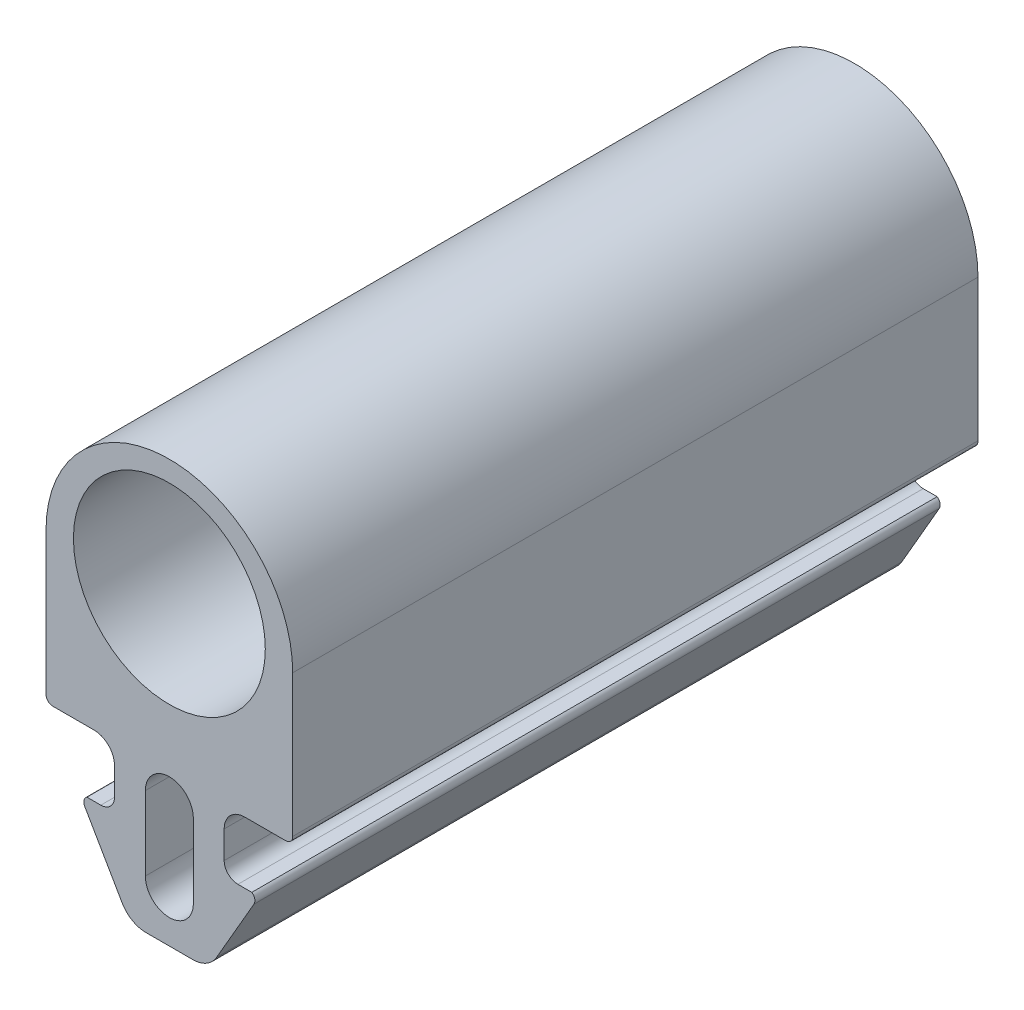
ISO-10303-21;
HEADER;
FILE_DESCRIPTION(('STEP AP214'),'2;1');
FILE_NAME('part.step','',(''),(''),'','','');
FILE_SCHEMA(('AUTOMOTIVE_DESIGN { 1 0 10303 214 1 1 1 1 }'));
ENDSEC;
DATA;
#1=APPLICATION_CONTEXT('core data for automotive mechanical design processes');
#2=APPLICATION_PROTOCOL_DEFINITION('international standard','automotive_design',2000,#1);
#3=PRODUCT_CONTEXT('',#1,'mechanical');
#4=PRODUCT('Part','Part','',(#3));
#5=PRODUCT_RELATED_PRODUCT_CATEGORY('part','',(#4));
#6=PRODUCT_DEFINITION_FORMATION('','',#4);
#7=PRODUCT_DEFINITION_CONTEXT('part definition',#1,'design');
#8=PRODUCT_DEFINITION('design','',#6,#7);
#9=PRODUCT_DEFINITION_SHAPE('','',#8);
#10=(LENGTH_UNIT() NAMED_UNIT(*) SI_UNIT(.MILLI.,.METRE.));
#11=(NAMED_UNIT(*) PLANE_ANGLE_UNIT() SI_UNIT($,.RADIAN.));
#12=(NAMED_UNIT(*) SI_UNIT($,.STERADIAN.) SOLID_ANGLE_UNIT());
#13=UNCERTAINTY_MEASURE_WITH_UNIT(LENGTH_MEASURE(1.E-05),#10,'distance_accuracy_value','');
#14=(GEOMETRIC_REPRESENTATION_CONTEXT(3) GLOBAL_UNCERTAINTY_ASSIGNED_CONTEXT((#13)) GLOBAL_UNIT_ASSIGNED_CONTEXT((#10,
#11,#12)) REPRESENTATION_CONTEXT('',''));
#15=CARTESIAN_POINT('',(0.,0.,0.));
#16=DIRECTION('',(0.,0.,1.));
#17=DIRECTION('',(1.,0.,0.));
#18=AXIS2_PLACEMENT_3D('',#15,#16,#17);
#19=CARTESIAN_POINT('',(1.89605275924265E-12,10.8645868639071,-30.));
#20=DIRECTION('',(0.,0.,1.));
#21=DIRECTION('',(1.,0.,0.));
#22=AXIS2_PLACEMENT_3D('',#19,#20,#21);
#23=CYLINDRICAL_SURFACE('',#22,8.99999999999883);
#24=CARTESIAN_POINT('',(1.89605275924265E-12,10.8645868639071,20.));
#25=DIRECTION('',(0.,0.,1.));
#26=DIRECTION('',(1.,0.,0.));
#27=AXIS2_PLACEMENT_3D('',#24,#25,#26);
#28=CIRCLE('',#27,8.99999999999883);
#29=CARTESIAN_POINT('',(9.00000000000078,10.8645868639071,20.));
#30=VERTEX_POINT('',#29);
#31=CARTESIAN_POINT('',(-8.99999999999688,10.8645868639071,20.));
#32=VERTEX_POINT('',#31);
#33=EDGE_CURVE('E245',#30,#32,#28,.T.);
#34=ORIENTED_EDGE('',*,*,#33,.F.);
#35=DIRECTION('',(0.,0.,1.));
#36=VECTOR('',#35,1.);
#37=CARTESIAN_POINT('',(9.00000000000078,10.8645868639071,-30.));
#38=LINE('',#37,#36);
#39=CARTESIAN_POINT('',(9.00000000000078,10.8645868639071,-30.));
#40=VERTEX_POINT('',#39);
#41=EDGE_CURVE('E11',#40,#30,#38,.T.);
#42=ORIENTED_EDGE('',*,*,#41,.F.);
#43=CARTESIAN_POINT('',(1.89605275924265E-12,10.8645868639071,-30.));
#44=DIRECTION('',(0.,0.,1.));
#45=DIRECTION('',(1.,0.,0.));
#46=AXIS2_PLACEMENT_3D('',#43,#44,#45);
#47=CIRCLE('',#46,8.99999999999883);
#48=CARTESIAN_POINT('',(-8.99999999999688,10.8645868639071,-30.));
#49=VERTEX_POINT('',#48);
#50=EDGE_CURVE('E249',#40,#49,#47,.T.);
#51=ORIENTED_EDGE('',*,*,#50,.T.);
#52=DIRECTION('',(0.,0.,1.));
#53=VECTOR('',#52,1.);
#54=CARTESIAN_POINT('',(-8.99999999999688,10.8645868639071,-30.));
#55=LINE('',#54,#53);
#56=EDGE_CURVE('E38',#49,#32,#55,.T.);
#57=ORIENTED_EDGE('',*,*,#56,.T.);
#58=EDGE_LOOP('',(#34,#42,#51,#57));
#59=FACE_BOUND('',#58,.T.);
#60=ADVANCED_FACE('F35',(#59),#23,.T.);
#61=CARTESIAN_POINT('',(9.00000000000088,0.52392483735149,-30.));
#62=DIRECTION('',(1.,0.,0.));
#63=DIRECTION('',(0.,1.,0.));
#64=AXIS2_PLACEMENT_3D('',#61,#62,#63);
#65=PLANE('',#64);
#66=DIRECTION('',(0.,1.,0.));
#67=VECTOR('',#66,1.);
#68=CARTESIAN_POINT('',(9.00000000000088,0.52392483735149,20.));
#69=LINE('',#68,#67);
#70=CARTESIAN_POINT('',(9.00000000000088,0.52392483735149,20.));
#71=VERTEX_POINT('',#70);
#72=EDGE_CURVE('E253',#71,#30,#69,.T.);
#73=ORIENTED_EDGE('',*,*,#72,.F.);
#74=DIRECTION('',(0.,0.,1.));
#75=VECTOR('',#74,1.);
#76=CARTESIAN_POINT('',(9.00000000000088,0.52392483735149,-30.));
#77=LINE('',#76,#75);
#78=CARTESIAN_POINT('',(9.00000000000088,0.52392483735149,-30.));
#79=VERTEX_POINT('',#78);
#80=EDGE_CURVE('E43',#79,#71,#77,.T.);
#81=ORIENTED_EDGE('',*,*,#80,.F.);
#82=DIRECTION('',(0.,1.,0.));
#83=VECTOR('',#82,1.);
#84=CARTESIAN_POINT('',(9.00000000000088,0.52392483735149,-30.));
#85=LINE('',#84,#83);
#86=EDGE_CURVE('E313',#79,#40,#85,.T.);
#87=ORIENTED_EDGE('',*,*,#86,.T.);
#88=ORIENTED_EDGE('',*,*,#41,.T.);
#89=EDGE_LOOP('',(#73,#81,#87,#88));
#90=FACE_BOUND('',#89,.T.);
#91=ADVANCED_FACE('F430',(#90),#65,.T.);
#92=CARTESIAN_POINT('',(8.50059730669664,0.499492278712887,-30.));
#93=DIRECTION('',(0.,0.,1.));
#94=DIRECTION('',(1.,0.,0.));
#95=AXIS2_PLACEMENT_3D('',#92,#93,#94);
#96=CYLINDRICAL_SURFACE('',#95,0.50000000000115);
#97=CARTESIAN_POINT('',(8.50059730669664,0.499492278712887,20.));
#98=DIRECTION('',(0.,0.,1.));
#99=DIRECTION('',(1.,0.,0.));
#100=AXIS2_PLACEMENT_3D('',#97,#98,#99);
#101=CIRCLE('',#100,0.50000000000115);
#102=CARTESIAN_POINT('',(8.47807035601008,-1.22623265708111E-13,20.));
#103=VERTEX_POINT('',#102);
#104=EDGE_CURVE('E375',#103,#71,#101,.T.);
#105=ORIENTED_EDGE('',*,*,#104,.F.);
#106=DIRECTION('',(0.,0.,1.));
#107=VECTOR('',#106,1.);
#108=CARTESIAN_POINT('',(8.47807035601008,-1.22623265708111E-13,-30.));
#109=LINE('',#108,#107);
#110=CARTESIAN_POINT('',(8.47807035601008,-1.22623265708111E-13,-30.));
#111=VERTEX_POINT('',#110);
#112=EDGE_CURVE('E381',#111,#103,#109,.T.);
#113=ORIENTED_EDGE('',*,*,#112,.F.);
#114=CARTESIAN_POINT('',(8.50059730669664,0.499492278712887,-30.));
#115=DIRECTION('',(0.,0.,1.));
#116=DIRECTION('',(1.,0.,0.));
#117=AXIS2_PLACEMENT_3D('',#114,#115,#116);
#118=CIRCLE('',#117,0.50000000000115);
#119=EDGE_CURVE('E310',#111,#79,#118,.T.);
#120=ORIENTED_EDGE('',*,*,#119,.T.);
#121=ORIENTED_EDGE('',*,*,#80,.T.);
#122=EDGE_LOOP('',(#105,#113,#120,#121));
#123=FACE_BOUND('',#122,.T.);
#124=ADVANCED_FACE('F505',(#123),#96,.T.);
#125=CARTESIAN_POINT('',(5.49999999999965,-1.15033850500712E-13,-30.));
#126=DIRECTION('',(0.,-1.,0.));
#127=DIRECTION('',(1.,0.,0.));
#128=AXIS2_PLACEMENT_3D('',#125,#126,#127);
#129=PLANE('',#128);
#130=DIRECTION('',(1.,0.,0.));
#131=VECTOR('',#130,1.);
#132=CARTESIAN_POINT('',(5.49999999999965,-1.15033850500712E-13,20.));
#133=LINE('',#132,#131);
#134=CARTESIAN_POINT('',(5.49999999999965,-1.15033850500712E-13,20.));
#135=VERTEX_POINT('',#134);
#136=EDGE_CURVE('E372',#135,#103,#133,.T.);
#137=ORIENTED_EDGE('',*,*,#136,.F.);
#138=DIRECTION('',(0.,0.,1.));
#139=VECTOR('',#138,1.);
#140=CARTESIAN_POINT('',(5.49999999999965,-1.15033850500712E-13,-30.));
#141=LINE('',#140,#139);
#142=CARTESIAN_POINT('',(5.49999999999965,-1.15033850500712E-13,-30.));
#143=VERTEX_POINT('',#142);
#144=EDGE_CURVE('E383',#143,#135,#141,.T.);
#145=ORIENTED_EDGE('',*,*,#144,.F.);
#146=DIRECTION('',(1.,0.,0.));
#147=VECTOR('',#146,1.);
#148=CARTESIAN_POINT('',(5.49999999999965,-1.15033850500712E-13,-30.));
#149=LINE('',#148,#147);
#150=EDGE_CURVE('E307',#143,#111,#149,.T.);
#151=ORIENTED_EDGE('',*,*,#150,.T.);
#152=ORIENTED_EDGE('',*,*,#112,.T.);
#153=EDGE_LOOP('',(#137,#145,#151,#152));
#154=FACE_BOUND('',#153,.T.);
#155=ADVANCED_FACE('F503',(#154),#129,.T.);
#156=CARTESIAN_POINT('',(5.49999999999963,-1.50000000000017,-30.));
#157=DIRECTION('',(0.,0.,1.));
#158=DIRECTION('',(1.,0.,0.));
#159=AXIS2_PLACEMENT_3D('',#156,#157,#158);
#160=CYLINDRICAL_SURFACE('',#159,1.50000000000001);
#161=CARTESIAN_POINT('',(5.49999999999963,-1.50000000000017,20.));
#162=DIRECTION('',(0.,0.,-1.));
#163=DIRECTION('',(-1.,0.,0.));
#164=AXIS2_PLACEMENT_3D('',#161,#162,#163);
#165=CIRCLE('',#164,1.50000000000001);
#166=CARTESIAN_POINT('',(3.99999999999962,-1.50000000000015,20.));
#167=VERTEX_POINT('',#166);
#168=EDGE_CURVE('E369',#167,#135,#165,.T.);
#169=ORIENTED_EDGE('',*,*,#168,.F.);
#170=DIRECTION('',(0.,0.,1.));
#171=VECTOR('',#170,1.);
#172=CARTESIAN_POINT('',(3.99999999999962,-1.50000000000015,-30.));
#173=LINE('',#172,#171);
#174=CARTESIAN_POINT('',(3.99999999999962,-1.50000000000015,-30.));
#175=VERTEX_POINT('',#174);
#176=EDGE_CURVE('E385',#175,#167,#173,.T.);
#177=ORIENTED_EDGE('',*,*,#176,.F.);
#178=CARTESIAN_POINT('',(5.49999999999963,-1.50000000000017,-30.));
#179=DIRECTION('',(0.,0.,-1.));
#180=DIRECTION('',(-1.,0.,0.));
#181=AXIS2_PLACEMENT_3D('',#178,#179,#180);
#182=CIRCLE('',#181,1.50000000000001);
#183=EDGE_CURVE('E304',#175,#143,#182,.T.);
#184=ORIENTED_EDGE('',*,*,#183,.T.);
#185=ORIENTED_EDGE('',*,*,#144,.T.);
#186=EDGE_LOOP('',(#169,#177,#184,#185));
#187=FACE_BOUND('',#186,.T.);
#188=ADVANCED_FACE('F499',(#187),#160,.F.);
#189=CARTESIAN_POINT('',(3.9999999999997,-3.49999999999885,-30.));
#190=DIRECTION('',(1.,0.,0.));
#191=DIRECTION('',(0.,1.,0.));
#192=AXIS2_PLACEMENT_3D('',#189,#190,#191);
#193=PLANE('',#192);
#194=DIRECTION('',(0.,1.,0.));
#195=VECTOR('',#194,1.);
#196=CARTESIAN_POINT('',(3.9999999999997,-3.49999999999885,20.));
#197=LINE('',#196,#195);
#198=CARTESIAN_POINT('',(3.9999999999997,-3.49999999999885,20.));
#199=VERTEX_POINT('',#198);
#200=EDGE_CURVE('E366',#199,#167,#197,.T.);
#201=ORIENTED_EDGE('',*,*,#200,.F.);
#202=DIRECTION('',(0.,0.,1.));
#203=VECTOR('',#202,1.);
#204=CARTESIAN_POINT('',(3.9999999999997,-3.49999999999885,-30.));
#205=LINE('',#204,#203);
#206=CARTESIAN_POINT('',(3.9999999999997,-3.49999999999885,-30.));
#207=VERTEX_POINT('',#206);
#208=EDGE_CURVE('E387',#207,#199,#205,.T.);
#209=ORIENTED_EDGE('',*,*,#208,.F.);
#210=DIRECTION('',(0.,1.,0.));
#211=VECTOR('',#210,1.);
#212=CARTESIAN_POINT('',(3.9999999999997,-3.49999999999885,-30.));
#213=LINE('',#212,#211);
#214=EDGE_CURVE('E301',#207,#175,#213,.T.);
#215=ORIENTED_EDGE('',*,*,#214,.T.);
#216=ORIENTED_EDGE('',*,*,#176,.T.);
#217=EDGE_LOOP('',(#201,#209,#215,#216));
#218=FACE_BOUND('',#217,.T.);
#219=ADVANCED_FACE('F495',(#218),#193,.T.);
#220=CARTESIAN_POINT('',(4.9999999999997,-3.49999999999885,-30.));
#221=DIRECTION('',(0.,0.,1.));
#222=DIRECTION('',(1.,0.,0.));
#223=AXIS2_PLACEMENT_3D('',#220,#221,#222);
#224=CYLINDRICAL_SURFACE('',#223,1.);
#225=CARTESIAN_POINT('',(4.9999999999997,-3.49999999999885,20.));
#226=DIRECTION('',(0.,0.,-1.));
#227=DIRECTION('',(-1.,0.,0.));
#228=AXIS2_PLACEMENT_3D('',#225,#226,#227);
#229=CIRCLE('',#228,1.);
#230=CARTESIAN_POINT('',(4.9999999999997,-4.49999999999885,20.));
#231=VERTEX_POINT('',#230);
#232=EDGE_CURVE('E363',#231,#199,#229,.T.);
#233=ORIENTED_EDGE('',*,*,#232,.F.);
#234=DIRECTION('',(0.,0.,1.));
#235=VECTOR('',#234,1.);
#236=CARTESIAN_POINT('',(4.9999999999997,-4.49999999999885,-30.));
#237=LINE('',#236,#235);
#238=CARTESIAN_POINT('',(4.9999999999997,-4.49999999999885,-30.));
#239=VERTEX_POINT('',#238);
#240=EDGE_CURVE('E389',#239,#231,#237,.T.);
#241=ORIENTED_EDGE('',*,*,#240,.F.);
#242=CARTESIAN_POINT('',(4.9999999999997,-3.49999999999885,-30.));
#243=DIRECTION('',(0.,0.,-1.));
#244=DIRECTION('',(-1.,0.,0.));
#245=AXIS2_PLACEMENT_3D('',#242,#243,#244);
#246=CIRCLE('',#245,1.);
#247=EDGE_CURVE('E298',#239,#207,#246,.T.);
#248=ORIENTED_EDGE('',*,*,#247,.T.);
#249=ORIENTED_EDGE('',*,*,#208,.T.);
#250=EDGE_LOOP('',(#233,#241,#248,#249));
#251=FACE_BOUND('',#250,.T.);
#252=ADVANCED_FACE('F491',(#251),#224,.F.);
#253=CARTESIAN_POINT('',(6.0160076135011,-4.49999999999891,-30.));
#254=DIRECTION('',(0.,1.,0.));
#255=DIRECTION('',(-1.,0.,0.));
#256=AXIS2_PLACEMENT_3D('',#253,#254,#255);
#257=PLANE('',#256);
#258=DIRECTION('',(-1.,0.,0.));
#259=VECTOR('',#258,1.);
#260=CARTESIAN_POINT('',(6.0160076135011,-4.49999999999891,20.));
#261=LINE('',#260,#259);
#262=CARTESIAN_POINT('',(6.0160076135011,-4.49999999999891,20.));
#263=VERTEX_POINT('',#262);
#264=EDGE_CURVE('E360',#263,#231,#261,.T.);
#265=ORIENTED_EDGE('',*,*,#264,.F.);
#266=DIRECTION('',(0.,0.,1.));
#267=VECTOR('',#266,1.);
#268=CARTESIAN_POINT('',(6.0160076135011,-4.49999999999891,-30.));
#269=LINE('',#268,#267);
#270=CARTESIAN_POINT('',(6.0160076135011,-4.49999999999891,-30.));
#271=VERTEX_POINT('',#270);
#272=EDGE_CURVE('E391',#271,#263,#269,.T.);
#273=ORIENTED_EDGE('',*,*,#272,.F.);
#274=DIRECTION('',(-1.,0.,0.));
#275=VECTOR('',#274,1.);
#276=CARTESIAN_POINT('',(6.0160076135011,-4.49999999999891,-30.));
#277=LINE('',#276,#275);
#278=EDGE_CURVE('E295',#271,#239,#277,.T.);
#279=ORIENTED_EDGE('',*,*,#278,.T.);
#280=ORIENTED_EDGE('',*,*,#240,.T.);
#281=EDGE_LOOP('',(#265,#273,#279,#280));
#282=FACE_BOUND('',#281,.T.);
#283=ADVANCED_FACE('F487',(#282),#257,.T.);
#284=CARTESIAN_POINT('',(5.7411809549003,-4.91769643010379,-30.));
#285=DIRECTION('',(0.,0.,1.));
#286=DIRECTION('',(1.,0.,0.));
#287=AXIS2_PLACEMENT_3D('',#284,#285,#286);
#288=CYLINDRICAL_SURFACE('',#287,0.50000000000003);
#289=CARTESIAN_POINT('',(5.7411809549003,-4.91769643010379,20.));
#290=DIRECTION('',(0.,0.,1.));
#291=DIRECTION('',(1.,0.,0.));
#292=AXIS2_PLACEMENT_3D('',#289,#290,#291);
#293=CIRCLE('',#292,0.50000000000003);
#294=CARTESIAN_POINT('',(6.17419365679255,-5.1676964301038,20.));
#295=VERTEX_POINT('',#294);
#296=EDGE_CURVE('E357',#295,#263,#293,.T.);
#297=ORIENTED_EDGE('',*,*,#296,.F.);
#298=DIRECTION('',(0.,0.,1.));
#299=VECTOR('',#298,1.);
#300=CARTESIAN_POINT('',(6.17419365679255,-5.1676964301038,-30.));
#301=LINE('',#300,#299);
#302=CARTESIAN_POINT('',(6.17419365679255,-5.1676964301038,-30.));
#303=VERTEX_POINT('',#302);
#304=EDGE_CURVE('E393',#303,#295,#301,.T.);
#305=ORIENTED_EDGE('',*,*,#304,.F.);
#306=CARTESIAN_POINT('',(5.7411809549003,-4.91769643010379,-30.));
#307=DIRECTION('',(0.,0.,1.));
#308=DIRECTION('',(1.,0.,0.));
#309=AXIS2_PLACEMENT_3D('',#306,#307,#308);
#310=CIRCLE('',#309,0.50000000000003);
#311=EDGE_CURVE('E292',#303,#271,#310,.T.);
#312=ORIENTED_EDGE('',*,*,#311,.T.);
#313=ORIENTED_EDGE('',*,*,#272,.T.);
#314=EDGE_LOOP('',(#297,#305,#312,#313));
#315=FACE_BOUND('',#314,.T.);
#316=ADVANCED_FACE('F483',(#315),#288,.T.);
#317=CARTESIAN_POINT('',(3.44004357329789,-9.90338329023524,-30.));
#318=DIRECTION('',(0.866025403784439,-0.5,0.));
#319=DIRECTION('',(0.5,0.866025403784439,0.));
#320=AXIS2_PLACEMENT_3D('',#317,#318,#319);
#321=PLANE('',#320);
#322=DIRECTION('',(0.5,0.866025403784439,0.));
#323=VECTOR('',#322,1.);
#324=CARTESIAN_POINT('',(3.44004357329789,-9.90338329023524,20.));
#325=LINE('',#324,#323);
#326=CARTESIAN_POINT('',(3.44004357329789,-9.90338329023524,20.));
#327=VERTEX_POINT('',#326);
#328=EDGE_CURVE('E354',#327,#295,#325,.T.);
#329=ORIENTED_EDGE('',*,*,#328,.F.);
#330=DIRECTION('',(0.,0.,1.));
#331=VECTOR('',#330,1.);
#332=CARTESIAN_POINT('',(3.44004357329789,-9.90338329023524,-30.));
#333=LINE('',#332,#331);
#334=CARTESIAN_POINT('',(3.44004357329789,-9.90338329023524,-30.));
#335=VERTEX_POINT('',#334);
#336=EDGE_CURVE('E395',#335,#327,#333,.T.);
#337=ORIENTED_EDGE('',*,*,#336,.F.);
#338=DIRECTION('',(0.5,0.866025403784439,0.));
#339=VECTOR('',#338,1.);
#340=CARTESIAN_POINT('',(3.44004357329789,-9.90338329023524,-30.));
#341=LINE('',#340,#339);
#342=EDGE_CURVE('E289',#335,#303,#341,.T.);
#343=ORIENTED_EDGE('',*,*,#342,.T.);
#344=ORIENTED_EDGE('',*,*,#304,.T.);
#345=EDGE_LOOP('',(#329,#337,#343,#344));
#346=FACE_BOUND('',#345,.T.);
#347=ADVANCED_FACE('F479',(#346),#321,.T.);
#348=CARTESIAN_POINT('',(1.70799276572915,-8.90338329023532,-30.));
#349=DIRECTION('',(0.,0.,1.));
#350=DIRECTION('',(1.,0.,0.));
#351=AXIS2_PLACEMENT_3D('',#348,#349,#350);
#352=CYLINDRICAL_SURFACE('',#351,1.99999999999984);
#353=CARTESIAN_POINT('',(1.70799276572915,-8.90338329023532,20.));
#354=DIRECTION('',(0.,0.,1.));
#355=DIRECTION('',(1.,0.,0.));
#356=AXIS2_PLACEMENT_3D('',#353,#354,#355);
#357=CIRCLE('',#356,1.99999999999984);
#358=CARTESIAN_POINT('',(1.70799276572915,-10.9033832902352,20.));
#359=VERTEX_POINT('',#358);
#360=EDGE_CURVE('E351',#359,#327,#357,.T.);
#361=ORIENTED_EDGE('',*,*,#360,.F.);
#362=DIRECTION('',(0.,0.,1.));
#363=VECTOR('',#362,1.);
#364=CARTESIAN_POINT('',(1.70799276572915,-10.9033832902352,-30.));
#365=LINE('',#364,#363);
#366=CARTESIAN_POINT('',(1.70799276572915,-10.9033832902352,-30.));
#367=VERTEX_POINT('',#366);
#368=EDGE_CURVE('E397',#367,#359,#365,.T.);
#369=ORIENTED_EDGE('',*,*,#368,.F.);
#370=CARTESIAN_POINT('',(1.70799276572915,-8.90338329023532,-30.));
#371=DIRECTION('',(0.,0.,1.));
#372=DIRECTION('',(1.,0.,0.));
#373=AXIS2_PLACEMENT_3D('',#370,#371,#372);
#374=CIRCLE('',#373,1.99999999999984);
#375=EDGE_CURVE('E286',#367,#335,#374,.T.);
#376=ORIENTED_EDGE('',*,*,#375,.T.);
#377=ORIENTED_EDGE('',*,*,#336,.T.);
#378=EDGE_LOOP('',(#361,#369,#376,#377));
#379=FACE_BOUND('',#378,.T.);
#380=ADVANCED_FACE('F475',(#379),#352,.T.);
#381=CARTESIAN_POINT('',(-1.70799276572332,-10.9033832902352,-30.));
#382=DIRECTION('',(0.,-1.,0.));
#383=DIRECTION('',(1.,0.,0.));
#384=AXIS2_PLACEMENT_3D('',#381,#382,#383);
#385=PLANE('',#384);
#386=DIRECTION('',(1.,0.,0.));
#387=VECTOR('',#386,1.);
#388=CARTESIAN_POINT('',(-1.70799276572332,-10.9033832902352,20.));
#389=LINE('',#388,#387);
#390=CARTESIAN_POINT('',(-1.70799276572332,-10.9033832902352,20.));
#391=VERTEX_POINT('',#390);
#392=EDGE_CURVE('E348',#391,#359,#389,.T.);
#393=ORIENTED_EDGE('',*,*,#392,.F.);
#394=DIRECTION('',(0.,0.,1.));
#395=VECTOR('',#394,1.);
#396=CARTESIAN_POINT('',(-1.70799276572332,-10.9033832902352,-30.));
#397=LINE('',#396,#395);
#398=CARTESIAN_POINT('',(-1.70799276572332,-10.9033832902352,-30.));
#399=VERTEX_POINT('',#398);
#400=EDGE_CURVE('E399',#399,#391,#397,.T.);
#401=ORIENTED_EDGE('',*,*,#400,.F.);
#402=DIRECTION('',(1.,0.,0.));
#403=VECTOR('',#402,1.);
#404=CARTESIAN_POINT('',(-1.70799276572332,-10.9033832902352,-30.));
#405=LINE('',#404,#403);
#406=EDGE_CURVE('E283',#399,#367,#405,.T.);
#407=ORIENTED_EDGE('',*,*,#406,.T.);
#408=ORIENTED_EDGE('',*,*,#368,.T.);
#409=EDGE_LOOP('',(#393,#401,#407,#408));
#410=FACE_BOUND('',#409,.T.);
#411=ADVANCED_FACE('F471',(#410),#385,.T.);
#412=CARTESIAN_POINT('',(-1.70799276572332,-8.90338329023573,-30.));
#413=DIRECTION('',(0.,0.,1.));
#414=DIRECTION('',(1.,0.,0.));
#415=AXIS2_PLACEMENT_3D('',#412,#413,#414);
#416=CYLINDRICAL_SURFACE('',#415,1.99999999999943);
#417=CARTESIAN_POINT('',(-1.70799276572332,-8.90338329023573,20.));
#418=DIRECTION('',(0.,0.,1.));
#419=DIRECTION('',(1.,0.,0.));
#420=AXIS2_PLACEMENT_3D('',#417,#418,#419);
#421=CIRCLE('',#420,1.99999999999943);
#422=CARTESIAN_POINT('',(-3.44004357329171,-9.90338329023544,20.));
#423=VERTEX_POINT('',#422);
#424=EDGE_CURVE('E345',#423,#391,#421,.T.);
#425=ORIENTED_EDGE('',*,*,#424,.F.);
#426=DIRECTION('',(0.,0.,1.));
#427=VECTOR('',#426,1.);
#428=CARTESIAN_POINT('',(-3.44004357329171,-9.90338329023544,-30.));
#429=LINE('',#428,#427);
#430=CARTESIAN_POINT('',(-3.44004357329171,-9.90338329023544,-30.));
#431=VERTEX_POINT('',#430);
#432=EDGE_CURVE('E401',#431,#423,#429,.T.);
#433=ORIENTED_EDGE('',*,*,#432,.F.);
#434=CARTESIAN_POINT('',(-1.70799276572332,-8.90338329023573,-30.));
#435=DIRECTION('',(0.,0.,1.));
#436=DIRECTION('',(1.,0.,0.));
#437=AXIS2_PLACEMENT_3D('',#434,#435,#436);
#438=CIRCLE('',#437,1.99999999999943);
#439=EDGE_CURVE('E280',#431,#399,#438,.T.);
#440=ORIENTED_EDGE('',*,*,#439,.T.);
#441=ORIENTED_EDGE('',*,*,#400,.T.);
#442=EDGE_LOOP('',(#425,#433,#440,#441));
#443=FACE_BOUND('',#442,.T.);
#444=ADVANCED_FACE('F467',(#443),#416,.T.);
#445=CARTESIAN_POINT('',(-6.17419365678656,-5.16769643010366,-30.));
#446=DIRECTION('',(-0.866025403784438,-0.5,0.));
#447=DIRECTION('',(0.5,-0.866025403784439,0.));
#448=AXIS2_PLACEMENT_3D('',#445,#446,#447);
#449=PLANE('',#448);
#450=DIRECTION('',(0.5,-0.866025403784439,0.));
#451=VECTOR('',#450,1.);
#452=CARTESIAN_POINT('',(-6.17419365678656,-5.16769643010366,20.));
#453=LINE('',#452,#451);
#454=CARTESIAN_POINT('',(-6.17419365678656,-5.16769643010366,20.));
#455=VERTEX_POINT('',#454);
#456=EDGE_CURVE('E342',#455,#423,#453,.T.);
#457=ORIENTED_EDGE('',*,*,#456,.F.);
#458=DIRECTION('',(0.,0.,1.));
#459=VECTOR('',#458,1.);
#460=CARTESIAN_POINT('',(-6.17419365678656,-5.16769643010366,-30.));
#461=LINE('',#460,#459);
#462=CARTESIAN_POINT('',(-6.17419365678656,-5.16769643010366,-30.));
#463=VERTEX_POINT('',#462);
#464=EDGE_CURVE('E403',#463,#455,#461,.T.);
#465=ORIENTED_EDGE('',*,*,#464,.F.);
#466=DIRECTION('',(0.5,-0.866025403784439,0.));
#467=VECTOR('',#466,1.);
#468=CARTESIAN_POINT('',(-6.17419365678656,-5.16769643010366,-30.));
#469=LINE('',#468,#467);
#470=EDGE_CURVE('E277',#463,#431,#469,.T.);
#471=ORIENTED_EDGE('',*,*,#470,.T.);
#472=ORIENTED_EDGE('',*,*,#432,.T.);
#473=EDGE_LOOP('',(#457,#465,#471,#472));
#474=FACE_BOUND('',#473,.T.);
#475=ADVANCED_FACE('F463',(#474),#449,.T.);
#476=CARTESIAN_POINT('',(-5.74118095489438,-4.91769643010368,-30.));
#477=DIRECTION('',(0.,0.,1.));
#478=DIRECTION('',(1.,0.,0.));
#479=AXIS2_PLACEMENT_3D('',#476,#477,#478);
#480=CYLINDRICAL_SURFACE('',#479,0.499999999999964);
#481=CARTESIAN_POINT('',(-5.74118095489438,-4.91769643010368,20.));
#482=DIRECTION('',(0.,0.,1.));
#483=DIRECTION('',(1.,0.,0.));
#484=AXIS2_PLACEMENT_3D('',#481,#482,#483);
#485=CIRCLE('',#484,0.499999999999964);
#486=CARTESIAN_POINT('',(-6.01600761349511,-4.49999999999885,20.));
#487=VERTEX_POINT('',#486);
#488=EDGE_CURVE('E339',#487,#455,#485,.T.);
#489=ORIENTED_EDGE('',*,*,#488,.F.);
#490=DIRECTION('',(0.,0.,1.));
#491=VECTOR('',#490,1.);
#492=CARTESIAN_POINT('',(-6.01600761349511,-4.49999999999885,-30.));
#493=LINE('',#492,#491);
#494=CARTESIAN_POINT('',(-6.01600761349511,-4.49999999999885,-30.));
#495=VERTEX_POINT('',#494);
#496=EDGE_CURVE('E405',#495,#487,#493,.T.);
#497=ORIENTED_EDGE('',*,*,#496,.F.);
#498=CARTESIAN_POINT('',(-5.74118095489438,-4.91769643010368,-30.));
#499=DIRECTION('',(0.,0.,1.));
#500=DIRECTION('',(1.,0.,0.));
#501=AXIS2_PLACEMENT_3D('',#498,#499,#500);
#502=CIRCLE('',#501,0.499999999999964);
#503=EDGE_CURVE('E274',#495,#463,#502,.T.);
#504=ORIENTED_EDGE('',*,*,#503,.T.);
#505=ORIENTED_EDGE('',*,*,#464,.T.);
#506=EDGE_LOOP('',(#489,#497,#504,#505));
#507=FACE_BOUND('',#506,.T.);
#508=ADVANCED_FACE('F459',(#507),#480,.T.);
#509=CARTESIAN_POINT('',(-4.99999999999678,-4.49999999999885,-30.));
#510=DIRECTION('',(0.,1.,0.));
#511=DIRECTION('',(-1.,0.,0.));
#512=AXIS2_PLACEMENT_3D('',#509,#510,#511);
#513=PLANE('',#512);
#514=DIRECTION('',(-1.,0.,0.));
#515=VECTOR('',#514,1.);
#516=CARTESIAN_POINT('',(-4.99999999999678,-4.49999999999885,20.));
#517=LINE('',#516,#515);
#518=CARTESIAN_POINT('',(-4.99999999999678,-4.49999999999885,20.));
#519=VERTEX_POINT('',#518);
#520=EDGE_CURVE('E336',#519,#487,#517,.T.);
#521=ORIENTED_EDGE('',*,*,#520,.F.);
#522=DIRECTION('',(0.,0.,1.));
#523=VECTOR('',#522,1.);
#524=CARTESIAN_POINT('',(-4.99999999999678,-4.49999999999885,-30.));
#525=LINE('',#524,#523);
#526=CARTESIAN_POINT('',(-4.99999999999678,-4.49999999999885,-30.));
#527=VERTEX_POINT('',#526);
#528=EDGE_CURVE('E407',#527,#519,#525,.T.);
#529=ORIENTED_EDGE('',*,*,#528,.F.);
#530=DIRECTION('',(-1.,0.,0.));
#531=VECTOR('',#530,1.);
#532=CARTESIAN_POINT('',(-4.99999999999678,-4.49999999999885,-30.));
#533=LINE('',#532,#531);
#534=EDGE_CURVE('E271',#527,#495,#533,.T.);
#535=ORIENTED_EDGE('',*,*,#534,.T.);
#536=ORIENTED_EDGE('',*,*,#496,.T.);
#537=EDGE_LOOP('',(#521,#529,#535,#536));
#538=FACE_BOUND('',#537,.T.);
#539=ADVANCED_FACE('F455',(#538),#513,.T.);
#540=CARTESIAN_POINT('',(-4.99999999999675,-3.49999999999889,-30.));
#541=DIRECTION('',(0.,0.,1.));
#542=DIRECTION('',(1.,0.,0.));
#543=AXIS2_PLACEMENT_3D('',#540,#541,#542);
#544=CYLINDRICAL_SURFACE('',#543,0.999999999999959);
#545=CARTESIAN_POINT('',(-4.99999999999675,-3.49999999999889,20.));
#546=DIRECTION('',(0.,0.,-1.));
#547=DIRECTION('',(-1.,0.,0.));
#548=AXIS2_PLACEMENT_3D('',#545,#546,#547);
#549=CIRCLE('',#548,0.999999999999959);
#550=CARTESIAN_POINT('',(-3.99999999999679,-3.49999999999889,20.));
#551=VERTEX_POINT('',#550);
#552=EDGE_CURVE('E333',#551,#519,#549,.T.);
#553=ORIENTED_EDGE('',*,*,#552,.F.);
#554=DIRECTION('',(0.,0.,1.));
#555=VECTOR('',#554,1.);
#556=CARTESIAN_POINT('',(-3.99999999999679,-3.49999999999889,-30.));
#557=LINE('',#556,#555);
#558=CARTESIAN_POINT('',(-3.99999999999679,-3.49999999999889,-30.));
#559=VERTEX_POINT('',#558);
#560=EDGE_CURVE('E409',#559,#551,#557,.T.);
#561=ORIENTED_EDGE('',*,*,#560,.F.);
#562=CARTESIAN_POINT('',(-4.99999999999675,-3.49999999999889,-30.));
#563=DIRECTION('',(0.,0.,-1.));
#564=DIRECTION('',(-1.,0.,0.));
#565=AXIS2_PLACEMENT_3D('',#562,#563,#564);
#566=CIRCLE('',#565,0.999999999999959);
#567=EDGE_CURVE('E268',#559,#527,#566,.T.);
#568=ORIENTED_EDGE('',*,*,#567,.T.);
#569=ORIENTED_EDGE('',*,*,#528,.T.);
#570=EDGE_LOOP('',(#553,#561,#568,#569));
#571=FACE_BOUND('',#570,.T.);
#572=ADVANCED_FACE('F451',(#571),#544,.F.);
#573=CARTESIAN_POINT('',(-3.99999999999679,-1.49999999999903,-30.));
#574=DIRECTION('',(-1.,0.,0.));
#575=DIRECTION('',(0.,-1.,0.));
#576=AXIS2_PLACEMENT_3D('',#573,#574,#575);
#577=PLANE('',#576);
#578=DIRECTION('',(0.,-1.,0.));
#579=VECTOR('',#578,1.);
#580=CARTESIAN_POINT('',(-3.99999999999679,-1.49999999999903,20.));
#581=LINE('',#580,#579);
#582=CARTESIAN_POINT('',(-3.99999999999679,-1.49999999999903,20.));
#583=VERTEX_POINT('',#582);
#584=EDGE_CURVE('E330',#583,#551,#581,.T.);
#585=ORIENTED_EDGE('',*,*,#584,.F.);
#586=DIRECTION('',(0.,0.,1.));
#587=VECTOR('',#586,1.);
#588=CARTESIAN_POINT('',(-3.99999999999679,-1.49999999999903,-30.));
#589=LINE('',#588,#587);
#590=CARTESIAN_POINT('',(-3.99999999999679,-1.49999999999903,-30.));
#591=VERTEX_POINT('',#590);
#592=EDGE_CURVE('E411',#591,#583,#589,.T.);
#593=ORIENTED_EDGE('',*,*,#592,.F.);
#594=DIRECTION('',(0.,-1.,0.));
#595=VECTOR('',#594,1.);
#596=CARTESIAN_POINT('',(-3.99999999999679,-1.49999999999903,-30.));
#597=LINE('',#596,#595);
#598=EDGE_CURVE('E265',#591,#559,#597,.T.);
#599=ORIENTED_EDGE('',*,*,#598,.T.);
#600=ORIENTED_EDGE('',*,*,#560,.T.);
#601=EDGE_LOOP('',(#585,#593,#599,#600));
#602=FACE_BOUND('',#601,.T.);
#603=ADVANCED_FACE('F447',(#602),#577,.T.);
#604=CARTESIAN_POINT('',(-5.4999999999957,-1.49999999999903,-30.));
#605=DIRECTION('',(0.,0.,1.));
#606=DIRECTION('',(1.,0.,0.));
#607=AXIS2_PLACEMENT_3D('',#604,#605,#606);
#608=CYLINDRICAL_SURFACE('',#607,1.49999999999892);
#609=CARTESIAN_POINT('',(-5.4999999999957,-1.49999999999903,20.));
#610=DIRECTION('',(0.,0.,-1.));
#611=DIRECTION('',(-1.,0.,0.));
#612=AXIS2_PLACEMENT_3D('',#609,#610,#611);
#613=CIRCLE('',#612,1.49999999999892);
#614=CARTESIAN_POINT('',(-5.4999999999957,-1.13841228110978E-13,20.));
#615=VERTEX_POINT('',#614);
#616=EDGE_CURVE('E327',#615,#583,#613,.T.);
#617=ORIENTED_EDGE('',*,*,#616,.F.);
#618=DIRECTION('',(0.,0.,1.));
#619=VECTOR('',#618,1.);
#620=CARTESIAN_POINT('',(-5.4999999999957,-1.13841228110978E-13,-30.));
#621=LINE('',#620,#619);
#622=CARTESIAN_POINT('',(-5.4999999999957,-1.13841228110978E-13,-30.));
#623=VERTEX_POINT('',#622);
#624=EDGE_CURVE('E413',#623,#615,#621,.T.);
#625=ORIENTED_EDGE('',*,*,#624,.F.);
#626=CARTESIAN_POINT('',(-5.4999999999957,-1.49999999999903,-30.));
#627=DIRECTION('',(0.,0.,-1.));
#628=DIRECTION('',(-1.,0.,0.));
#629=AXIS2_PLACEMENT_3D('',#626,#627,#628);
#630=CIRCLE('',#629,1.49999999999892);
#631=EDGE_CURVE('E262',#623,#591,#630,.T.);
#632=ORIENTED_EDGE('',*,*,#631,.T.);
#633=ORIENTED_EDGE('',*,*,#592,.T.);
#634=EDGE_LOOP('',(#617,#625,#632,#633));
#635=FACE_BOUND('',#634,.T.);
#636=ADVANCED_FACE('F443',(#635),#608,.F.);
#637=CARTESIAN_POINT('',(-8.47807035600795,-1.25821662116943E-13,-30.));
#638=DIRECTION('',(0.,-1.,0.));
#639=DIRECTION('',(1.,0.,0.));
#640=AXIS2_PLACEMENT_3D('',#637,#638,#639);
#641=PLANE('',#640);
#642=DIRECTION('',(1.,0.,0.));
#643=VECTOR('',#642,1.);
#644=CARTESIAN_POINT('',(-8.47807035600795,-1.25821662116943E-13,20.));
#645=LINE('',#644,#643);
#646=CARTESIAN_POINT('',(-8.47807035600795,-1.25821662116943E-13,20.));
#647=VERTEX_POINT('',#646);
#648=EDGE_CURVE('E324',#647,#615,#645,.T.);
#649=ORIENTED_EDGE('',*,*,#648,.F.);
#650=DIRECTION('',(0.,0.,1.));
#651=VECTOR('',#650,1.);
#652=CARTESIAN_POINT('',(-8.47807035600795,-1.25821662116943E-13,-30.));
#653=LINE('',#652,#651);
#654=CARTESIAN_POINT('',(-8.47807035600795,-1.25821662116943E-13,-30.));
#655=VERTEX_POINT('',#654);
#656=EDGE_CURVE('E415',#655,#647,#653,.T.);
#657=ORIENTED_EDGE('',*,*,#656,.F.);
#658=DIRECTION('',(1.,0.,0.));
#659=VECTOR('',#658,1.);
#660=CARTESIAN_POINT('',(-8.47807035600795,-1.25821662116943E-13,-30.));
#661=LINE('',#660,#659);
#662=EDGE_CURVE('E259',#655,#623,#661,.T.);
#663=ORIENTED_EDGE('',*,*,#662,.T.);
#664=ORIENTED_EDGE('',*,*,#624,.T.);
#665=EDGE_LOOP('',(#649,#657,#663,#664));
#666=FACE_BOUND('',#665,.T.);
#667=ADVANCED_FACE('F441',(#666),#641,.T.);
#668=CARTESIAN_POINT('',(-8.50059730669262,0.499492278712937,-30.));
#669=DIRECTION('',(0.,0.,1.));
#670=DIRECTION('',(1.,0.,0.));
#671=AXIS2_PLACEMENT_3D('',#668,#669,#670);
#672=CYLINDRICAL_SURFACE('',#671,0.500000000001122);
#673=CARTESIAN_POINT('',(-8.50059730669262,0.499492278712937,20.));
#674=DIRECTION('',(0.,0.,1.));
#675=DIRECTION('',(1.,0.,0.));
#676=AXIS2_PLACEMENT_3D('',#673,#674,#675);
#677=CIRCLE('',#676,0.500000000001122);
#678=CARTESIAN_POINT('',(-8.9999999999969,0.523924837349933,20.));
#679=VERTEX_POINT('',#678);
#680=EDGE_CURVE('E321',#679,#647,#677,.T.);
#681=ORIENTED_EDGE('',*,*,#680,.F.);
#682=DIRECTION('',(0.,0.,1.));
#683=VECTOR('',#682,1.);
#684=CARTESIAN_POINT('',(-8.9999999999969,0.523924837349933,-30.));
#685=LINE('',#684,#683);
#686=CARTESIAN_POINT('',(-8.9999999999969,0.523924837349933,-30.));
#687=VERTEX_POINT('',#686);
#688=EDGE_CURVE('E416',#687,#679,#685,.T.);
#689=ORIENTED_EDGE('',*,*,#688,.F.);
#690=CARTESIAN_POINT('',(-8.50059730669262,0.499492278712937,-30.));
#691=DIRECTION('',(0.,0.,1.));
#692=DIRECTION('',(1.,0.,0.));
#693=AXIS2_PLACEMENT_3D('',#690,#691,#692);
#694=CIRCLE('',#693,0.500000000001122);
#695=EDGE_CURVE('E256',#687,#655,#694,.T.);
#696=ORIENTED_EDGE('',*,*,#695,.T.);
#697=ORIENTED_EDGE('',*,*,#656,.T.);
#698=EDGE_LOOP('',(#681,#689,#696,#697));
#699=FACE_BOUND('',#698,.T.);
#700=ADVANCED_FACE('F437',(#699),#672,.T.);
#701=CARTESIAN_POINT('',(-8.99999999999688,10.8645868639071,-30.));
#702=DIRECTION('',(-1.,0.,0.));
#703=DIRECTION('',(0.,-1.,0.));
#704=AXIS2_PLACEMENT_3D('',#701,#702,#703);
#705=PLANE('',#704);
#706=DIRECTION('',(0.,-1.,0.));
#707=VECTOR('',#706,1.);
#708=CARTESIAN_POINT('',(-8.99999999999688,10.8645868639071,20.));
#709=LINE('',#708,#707);
#710=EDGE_CURVE('E318',#32,#679,#709,.T.);
#711=ORIENTED_EDGE('',*,*,#710,.F.);
#712=ORIENTED_EDGE('',*,*,#56,.F.);
#713=DIRECTION('',(0.,-1.,0.));
#714=VECTOR('',#713,1.);
#715=CARTESIAN_POINT('',(-8.99999999999688,10.8645868639071,-30.));
#716=LINE('',#715,#714);
#717=EDGE_CURVE('E252',#49,#687,#716,.T.);
#718=ORIENTED_EDGE('',*,*,#717,.T.);
#719=ORIENTED_EDGE('',*,*,#688,.T.);
#720=EDGE_LOOP('',(#711,#712,#718,#719));
#721=FACE_BOUND('',#720,.T.);
#722=ADVANCED_FACE('F424',(#721),#705,.T.);
#723=CARTESIAN_POINT('',(1.89605275924265E-12,10.8645868639071,-30.));
#724=DIRECTION('',(0.,0.,1.));
#725=DIRECTION('',(1.,0.,0.));
#726=AXIS2_PLACEMENT_3D('',#723,#724,#725);
#727=PLANE('',#726);
#728=CARTESIAN_POINT('',(0.,11.36,-30.));
#729=DIRECTION('',(0.,0.,1.));
#730=DIRECTION('',(-1.,0.,0.));
#731=AXIS2_PLACEMENT_3D('',#728,#729,#730);
#732=CIRCLE('',#731,7.);
#733=CARTESIAN_POINT('',(7.,11.36,-30.));
#734=VERTEX_POINT('',#733);
#735=EDGE_CURVE('E239',#734,#734,#732,.T.);
#736=ORIENTED_EDGE('',*,*,#735,.T.);
#737=EDGE_LOOP('',(#736));
#738=FACE_BOUND('',#737,.T.);
#739=DIRECTION('',(0.,1.,0.));
#740=VECTOR('',#739,1.);
#741=CARTESIAN_POINT('',(1.7500000000002,-1.95338329023615,-30.));
#742=LINE('',#741,#740);
#743=CARTESIAN_POINT('',(1.75000000000019,-7.3515288385757,-30.));
#744=VERTEX_POINT('',#743);
#745=CARTESIAN_POINT('',(1.7500000000002,-1.95338329023615,-30.));
#746=VERTEX_POINT('',#745);
#747=EDGE_CURVE('E216',#744,#746,#742,.T.);
#748=ORIENTED_EDGE('',*,*,#747,.T.);
#749=CARTESIAN_POINT('',(1.70111320862976E-13,-1.95338329023613,-30.));
#750=DIRECTION('',(0.,0.,1.));
#751=DIRECTION('',(-1.,0.,0.));
#752=AXIS2_PLACEMENT_3D('',#749,#750,#751);
#753=CIRCLE('',#752,1.75);
#754=CARTESIAN_POINT('',(-1.74999999999979,-1.95338329023617,-30.));
#755=VERTEX_POINT('',#754);
#756=EDGE_CURVE('E210',#746,#755,#753,.T.);
#757=ORIENTED_EDGE('',*,*,#756,.T.);
#758=DIRECTION('',(0.,-1.,0.));
#759=VECTOR('',#758,1.);
#760=CARTESIAN_POINT('',(-1.74999999999978,-7.35152883857567,-30.));
#761=LINE('',#760,#759);
#762=CARTESIAN_POINT('',(-1.74999999999978,-7.35152883857567,-30.));
#763=VERTEX_POINT('',#762);
#764=EDGE_CURVE('E219',#755,#763,#761,.T.);
#765=ORIENTED_EDGE('',*,*,#764,.T.);
#766=CARTESIAN_POINT('',(2.02203705168547E-13,-7.3515288385757,-30.));
#767=DIRECTION('',(0.,0.,1.));
#768=DIRECTION('',(-1.,0.,0.));
#769=AXIS2_PLACEMENT_3D('',#766,#767,#768);
#770=CIRCLE('',#769,1.74999999999999);
#771=EDGE_CURVE('E51',#763,#744,#770,.T.);
#772=ORIENTED_EDGE('',*,*,#771,.T.);
#773=EDGE_LOOP('',(#748,#757,#765,#772));
#774=FACE_BOUND('',#773,.T.);
#775=ORIENTED_EDGE('',*,*,#50,.F.);
#776=ORIENTED_EDGE('',*,*,#86,.F.);
#777=ORIENTED_EDGE('',*,*,#119,.F.);
#778=ORIENTED_EDGE('',*,*,#150,.F.);
#779=ORIENTED_EDGE('',*,*,#183,.F.);
#780=ORIENTED_EDGE('',*,*,#214,.F.);
#781=ORIENTED_EDGE('',*,*,#247,.F.);
#782=ORIENTED_EDGE('',*,*,#278,.F.);
#783=ORIENTED_EDGE('',*,*,#311,.F.);
#784=ORIENTED_EDGE('',*,*,#342,.F.);
#785=ORIENTED_EDGE('',*,*,#375,.F.);
#786=ORIENTED_EDGE('',*,*,#406,.F.);
#787=ORIENTED_EDGE('',*,*,#439,.F.);
#788=ORIENTED_EDGE('',*,*,#470,.F.);
#789=ORIENTED_EDGE('',*,*,#503,.F.);
#790=ORIENTED_EDGE('',*,*,#534,.F.);
#791=ORIENTED_EDGE('',*,*,#567,.F.);
#792=ORIENTED_EDGE('',*,*,#598,.F.);
#793=ORIENTED_EDGE('',*,*,#631,.F.);
#794=ORIENTED_EDGE('',*,*,#662,.F.);
#795=ORIENTED_EDGE('',*,*,#695,.F.);
#796=ORIENTED_EDGE('',*,*,#717,.F.);
#797=EDGE_LOOP('',(#775,#776,#777,#778,#779,#780,#781,#782,#783,#784,#785,#786,#787,#788,#789,
#790,#791,#792,#793,#794,#795,#796));
#798=FACE_BOUND('',#797,.T.);
#799=ADVANCED_FACE('F223',(#738,#774,#798),#727,.F.);
#800=CARTESIAN_POINT('',(1.89605275924265E-12,10.8645868639071,20.));
#801=DIRECTION('',(0.,0.,1.));
#802=DIRECTION('',(1.,0.,0.));
#803=AXIS2_PLACEMENT_3D('',#800,#801,#802);
#804=PLANE('',#803);
#805=CARTESIAN_POINT('',(0.,11.36,20.));
#806=DIRECTION('',(0.,0.,1.));
#807=DIRECTION('',(-1.,0.,0.));
#808=AXIS2_PLACEMENT_3D('',#805,#806,#807);
#809=CIRCLE('',#808,7.);
#810=CARTESIAN_POINT('',(7.,11.36,20.));
#811=VERTEX_POINT('',#810);
#812=EDGE_CURVE('E232',#811,#811,#809,.T.);
#813=ORIENTED_EDGE('',*,*,#812,.F.);
#814=EDGE_LOOP('',(#813));
#815=FACE_BOUND('',#814,.T.);
#816=CARTESIAN_POINT('',(1.70111320862976E-13,-1.95338329023613,20.));
#817=DIRECTION('',(0.,0.,1.));
#818=DIRECTION('',(-1.,0.,0.));
#819=AXIS2_PLACEMENT_3D('',#816,#817,#818);
#820=CIRCLE('',#819,1.75);
#821=CARTESIAN_POINT('',(1.7500000000002,-1.95338329023615,20.));
#822=VERTEX_POINT('',#821);
#823=CARTESIAN_POINT('',(-1.74999999999979,-1.95338329023617,20.));
#824=VERTEX_POINT('',#823);
#825=EDGE_CURVE('E59',#822,#824,#820,.T.);
#826=ORIENTED_EDGE('',*,*,#825,.F.);
#827=DIRECTION('',(0.,1.,0.));
#828=VECTOR('',#827,1.);
#829=CARTESIAN_POINT('',(1.7500000000002,-1.95338329023615,20.));
#830=LINE('',#829,#828);
#831=CARTESIAN_POINT('',(1.75000000000019,-7.3515288385757,20.));
#832=VERTEX_POINT('',#831);
#833=EDGE_CURVE('E226',#832,#822,#830,.T.);
#834=ORIENTED_EDGE('',*,*,#833,.F.);
#835=CARTESIAN_POINT('',(2.02203705168547E-13,-7.3515288385757,20.));
#836=DIRECTION('',(0.,0.,1.));
#837=DIRECTION('',(-1.,0.,0.));
#838=AXIS2_PLACEMENT_3D('',#835,#836,#837);
#839=CIRCLE('',#838,1.74999999999999);
#840=CARTESIAN_POINT('',(-1.74999999999978,-7.35152883857567,20.));
#841=VERTEX_POINT('',#840);
#842=EDGE_CURVE('E229',#841,#832,#839,.T.);
#843=ORIENTED_EDGE('',*,*,#842,.F.);
#844=DIRECTION('',(0.,-1.,0.));
#845=VECTOR('',#844,1.);
#846=CARTESIAN_POINT('',(-1.74999999999978,-7.35152883857567,20.));
#847=LINE('',#846,#845);
#848=EDGE_CURVE('E238',#824,#841,#847,.T.);
#849=ORIENTED_EDGE('',*,*,#848,.F.);
#850=EDGE_LOOP('',(#826,#834,#843,#849));
#851=FACE_BOUND('',#850,.T.);
#852=ORIENTED_EDGE('',*,*,#33,.T.);
#853=ORIENTED_EDGE('',*,*,#710,.T.);
#854=ORIENTED_EDGE('',*,*,#680,.T.);
#855=ORIENTED_EDGE('',*,*,#648,.T.);
#856=ORIENTED_EDGE('',*,*,#616,.T.);
#857=ORIENTED_EDGE('',*,*,#584,.T.);
#858=ORIENTED_EDGE('',*,*,#552,.T.);
#859=ORIENTED_EDGE('',*,*,#520,.T.);
#860=ORIENTED_EDGE('',*,*,#488,.T.);
#861=ORIENTED_EDGE('',*,*,#456,.T.);
#862=ORIENTED_EDGE('',*,*,#424,.T.);
#863=ORIENTED_EDGE('',*,*,#392,.T.);
#864=ORIENTED_EDGE('',*,*,#360,.T.);
#865=ORIENTED_EDGE('',*,*,#328,.T.);
#866=ORIENTED_EDGE('',*,*,#296,.T.);
#867=ORIENTED_EDGE('',*,*,#264,.T.);
#868=ORIENTED_EDGE('',*,*,#232,.T.);
#869=ORIENTED_EDGE('',*,*,#200,.T.);
#870=ORIENTED_EDGE('',*,*,#168,.T.);
#871=ORIENTED_EDGE('',*,*,#136,.T.);
#872=ORIENTED_EDGE('',*,*,#104,.T.);
#873=ORIENTED_EDGE('',*,*,#72,.T.);
#874=EDGE_LOOP('',(#852,#853,#854,#855,#856,#857,#858,#859,#860,#861,#862,#863,#864,#865,#866,
#867,#868,#869,#870,#871,#872,#873));
#875=FACE_BOUND('',#874,.T.);
#876=ADVANCED_FACE('F426',(#815,#851,#875),#804,.T.);
#877=CARTESIAN_POINT('',(1.70111320862976E-13,-1.95338329023613,-30.));
#878=DIRECTION('',(0.,0.,1.));
#879=DIRECTION('',(1.,0.,0.));
#880=AXIS2_PLACEMENT_3D('',#877,#878,#879);
#881=CYLINDRICAL_SURFACE('',#880,1.75);
#882=ORIENTED_EDGE('',*,*,#825,.T.);
#883=DIRECTION('',(0.,0.,1.));
#884=VECTOR('',#883,1.);
#885=CARTESIAN_POINT('',(-1.74999999999979,-1.95338329023617,-30.));
#886=LINE('',#885,#884);
#887=EDGE_CURVE('E206',#755,#824,#886,.T.);
#888=ORIENTED_EDGE('',*,*,#887,.F.);
#889=ORIENTED_EDGE('',*,*,#756,.F.);
#890=DIRECTION('',(0.,0.,1.));
#891=VECTOR('',#890,1.);
#892=CARTESIAN_POINT('',(1.7500000000002,-1.95338329023615,-30.));
#893=LINE('',#892,#891);
#894=EDGE_CURVE('E243',#746,#822,#893,.T.);
#895=ORIENTED_EDGE('',*,*,#894,.T.);
#896=EDGE_LOOP('',(#882,#888,#889,#895));
#897=FACE_BOUND('',#896,.T.);
#898=ADVANCED_FACE('F208',(#897),#881,.F.);
#899=CARTESIAN_POINT('',(1.7500000000002,-1.95338329023615,-30.));
#900=DIRECTION('',(1.,0.,0.));
#901=DIRECTION('',(0.,1.,0.));
#902=AXIS2_PLACEMENT_3D('',#899,#900,#901);
#903=PLANE('',#902);
#904=ORIENTED_EDGE('',*,*,#833,.T.);
#905=ORIENTED_EDGE('',*,*,#894,.F.);
#906=ORIENTED_EDGE('',*,*,#747,.F.);
#907=DIRECTION('',(0.,0.,1.));
#908=VECTOR('',#907,1.);
#909=CARTESIAN_POINT('',(1.75000000000019,-7.3515288385757,-30.));
#910=LINE('',#909,#908);
#911=EDGE_CURVE('E246',#744,#832,#910,.T.);
#912=ORIENTED_EDGE('',*,*,#911,.T.);
#913=EDGE_LOOP('',(#904,#905,#906,#912));
#914=FACE_BOUND('',#913,.T.);
#915=ADVANCED_FACE('F701',(#914),#903,.F.);
#916=CARTESIAN_POINT('',(2.02203705168547E-13,-7.3515288385757,-30.));
#917=DIRECTION('',(0.,0.,1.));
#918=DIRECTION('',(1.,0.,0.));
#919=AXIS2_PLACEMENT_3D('',#916,#917,#918);
#920=CYLINDRICAL_SURFACE('',#919,1.74999999999999);
#921=ORIENTED_EDGE('',*,*,#842,.T.);
#922=ORIENTED_EDGE('',*,*,#911,.F.);
#923=ORIENTED_EDGE('',*,*,#771,.F.);
#924=DIRECTION('',(0.,0.,1.));
#925=VECTOR('',#924,1.);
#926=CARTESIAN_POINT('',(-1.74999999999978,-7.35152883857567,-30.));
#927=LINE('',#926,#925);
#928=EDGE_CURVE('E215',#763,#841,#927,.T.);
#929=ORIENTED_EDGE('',*,*,#928,.T.);
#930=EDGE_LOOP('',(#921,#922,#923,#929));
#931=FACE_BOUND('',#930,.T.);
#932=ADVANCED_FACE('F710',(#931),#920,.F.);
#933=CARTESIAN_POINT('',(-1.74999999999978,-7.35152883857567,-30.));
#934=DIRECTION('',(-1.,0.,0.));
#935=DIRECTION('',(0.,-1.,0.));
#936=AXIS2_PLACEMENT_3D('',#933,#934,#935);
#937=PLANE('',#936);
#938=ORIENTED_EDGE('',*,*,#848,.T.);
#939=ORIENTED_EDGE('',*,*,#928,.F.);
#940=ORIENTED_EDGE('',*,*,#764,.F.);
#941=ORIENTED_EDGE('',*,*,#887,.T.);
#942=EDGE_LOOP('',(#938,#939,#940,#941));
#943=FACE_BOUND('',#942,.T.);
#944=ADVANCED_FACE('F220',(#943),#937,.F.);
#945=CARTESIAN_POINT('',(0.,11.36,-30.));
#946=DIRECTION('',(0.,0.,1.));
#947=DIRECTION('',(1.,0.,0.));
#948=AXIS2_PLACEMENT_3D('',#945,#946,#947);
#949=CYLINDRICAL_SURFACE('',#948,7.);
#950=CARTESIAN_POINT('',(7.,11.36,-30.));
#951=CARTESIAN_POINT('',(7.,11.36,-29.4791666666667));
#952=CARTESIAN_POINT('',(7.,11.36,-28.9583333333333));
#953=CARTESIAN_POINT('',(7.,11.36,-27.9166666666667));
#954=CARTESIAN_POINT('',(7.,11.36,-27.3958333333333));
#955=CARTESIAN_POINT('',(7.,11.36,-26.3541666666667));
#956=CARTESIAN_POINT('',(7.,11.36,-25.8333333333333));
#957=CARTESIAN_POINT('',(7.,11.36,-24.7916666666667));
#958=CARTESIAN_POINT('',(7.,11.36,-24.2708333333333));
#959=CARTESIAN_POINT('',(7.,11.36,-23.2291666666667));
#960=CARTESIAN_POINT('',(7.,11.36,-22.7083333333333));
#961=CARTESIAN_POINT('',(7.,11.36,-21.6666666666667));
#962=CARTESIAN_POINT('',(7.,11.36,-21.1458333333333));
#963=CARTESIAN_POINT('',(7.,11.36,-20.1041666666667));
#964=CARTESIAN_POINT('',(7.,11.36,-19.5833333333333));
#965=CARTESIAN_POINT('',(7.,11.36,-18.5416666666667));
#966=CARTESIAN_POINT('',(7.,11.36,-18.0208333333333));
#967=CARTESIAN_POINT('',(7.,11.36,-16.9791666666667));
#968=CARTESIAN_POINT('',(7.,11.36,-16.4583333333333));
#969=CARTESIAN_POINT('',(7.,11.36,-15.4166666666667));
#970=CARTESIAN_POINT('',(7.,11.36,-14.8958333333333));
#971=CARTESIAN_POINT('',(7.,11.36,-13.8541666666667));
#972=CARTESIAN_POINT('',(7.,11.36,-13.3333333333333));
#973=CARTESIAN_POINT('',(7.,11.36,-12.2916666666667));
#974=CARTESIAN_POINT('',(7.,11.36,-11.7708333333333));
#975=CARTESIAN_POINT('',(7.,11.36,-10.7291666666667));
#976=CARTESIAN_POINT('',(7.,11.36,-10.2083333333333));
#977=CARTESIAN_POINT('',(7.,11.36,-9.16666666666667));
#978=CARTESIAN_POINT('',(7.,11.36,-8.64583333333333));
#979=CARTESIAN_POINT('',(7.,11.36,-7.60416666666667));
#980=CARTESIAN_POINT('',(7.,11.36,-7.08333333333333));
#981=CARTESIAN_POINT('',(7.,11.36,-6.04166666666667));
#982=CARTESIAN_POINT('',(7.,11.36,-5.52083333333333));
#983=CARTESIAN_POINT('',(7.,11.36,-4.47916666666667));
#984=CARTESIAN_POINT('',(7.,11.36,-3.95833333333333));
#985=CARTESIAN_POINT('',(7.,11.36,-2.91666666666667));
#986=CARTESIAN_POINT('',(7.,11.36,-2.39583333333333));
#987=CARTESIAN_POINT('',(7.,11.36,-1.35416666666667));
#988=CARTESIAN_POINT('',(7.,11.36,-0.833333333333334));
#989=CARTESIAN_POINT('',(7.,11.36,0.208333333333332));
#990=CARTESIAN_POINT('',(7.,11.36,0.729166666666665));
#991=CARTESIAN_POINT('',(7.,11.36,1.77083333333333));
#992=CARTESIAN_POINT('',(7.,11.36,2.29166666666667));
#993=CARTESIAN_POINT('',(7.,11.36,3.33333333333333));
#994=CARTESIAN_POINT('',(7.,11.36,3.85416666666667));
#995=CARTESIAN_POINT('',(7.,11.36,4.89583333333333));
#996=CARTESIAN_POINT('',(7.,11.36,5.41666666666667));
#997=CARTESIAN_POINT('',(7.,11.36,6.45833333333333));
#998=CARTESIAN_POINT('',(7.,11.36,6.97916666666667));
#999=CARTESIAN_POINT('',(7.,11.36,8.02083333333333));
#1000=CARTESIAN_POINT('',(7.,11.36,8.54166666666667));
#1001=CARTESIAN_POINT('',(7.,11.36,9.58333333333333));
#1002=CARTESIAN_POINT('',(7.,11.36,10.1041666666667));
#1003=CARTESIAN_POINT('',(7.,11.36,11.1458333333333));
#1004=CARTESIAN_POINT('',(7.,11.36,11.6666666666667));
#1005=CARTESIAN_POINT('',(7.,11.36,12.7083333333333));
#1006=CARTESIAN_POINT('',(7.,11.36,13.2291666666667));
#1007=CARTESIAN_POINT('',(7.,11.36,14.2708333333333));
#1008=CARTESIAN_POINT('',(7.,11.36,14.7916666666667));
#1009=CARTESIAN_POINT('',(7.,11.36,15.8333333333333));
#1010=CARTESIAN_POINT('',(7.,11.36,16.3541666666667));
#1011=CARTESIAN_POINT('',(7.,11.36,17.3958333333333));
#1012=CARTESIAN_POINT('',(7.,11.36,17.9166666666667));
#1013=CARTESIAN_POINT('',(7.,11.36,18.9583333333333));
#1014=CARTESIAN_POINT('',(7.,11.36,19.4791666666667));
#1015=CARTESIAN_POINT('',(7.,11.36,20.));
#1016=B_SPLINE_CURVE_WITH_KNOTS('',3,(#950,#951,#952,#953,#954,#955,#956,#957,#958,#959,#960,
#961,#962,#963,#964,#965,#966,#967,#968,#969,#970,#971,#972,#973,#974,#975,#976,#977,#978,#979,
#980,#981,#982,#983,#984,#985,#986,#987,#988,#989,#990,#991,#992,#993,#994,#995,#996,#997,#998,
#999,#1000,#1001,#1002,#1003,#1004,#1005,#1006,#1007,#1008,#1009,#1010,#1011,#1012,#1013,#1014,
#1015),.UNSPECIFIED.,.F.,.F.,(4,2,2,2,2,2,2,2,2,2,2,2,2,2,2,2,2,2,2,2,2,2,2,2,2,2,2,2,2,2,2,2,
4),(0.,1.5625,3.125,4.6875,6.25,7.8125,9.375,10.9375,12.5,14.0625,15.625,17.1875,18.75,20.3125,
21.875,23.4375,25.,26.5625,28.125,29.6875,31.25,32.8125,34.375,35.9375,37.5,39.0625,40.625,
42.1875,43.75,45.3125,46.875,48.4375,50.),.UNSPECIFIED.);
#1017=EDGE_CURVE('BSEAM728',#734,#811,#1016,.T.);
#1018=ORIENTED_EDGE('',*,*,#735,.F.);
#1019=ORIENTED_EDGE('',*,*,#812,.T.);
#1020=ORIENTED_EDGE('',*,*,#1017,.T.);
#1021=ORIENTED_EDGE('',*,*,#1017,.F.);
#1022=EDGE_LOOP('',(#1018,#1020,#1019,#1021));
#1023=FACE_BOUND('',#1022,.T.);
#1024=ADVANCED_FACE('F728',(#1023),#949,.F.);
#1025=CLOSED_SHELL('',(#60,#91,#124,#155,#188,#219,#252,#283,#316,#347,#380,#411,#444,#475,#508,
#539,#572,#603,#636,#667,#700,#722,#799,#876,#898,#915,#932,#944,#1024));
#1026=MANIFOLD_SOLID_BREP('B2',#1025);
#1027=ADVANCED_BREP_SHAPE_REPRESENTATION('',(#18,#1026),#14);
#1028=SHAPE_DEFINITION_REPRESENTATION(#9,#1027);
ENDSEC;
END-ISO-10303-21;
